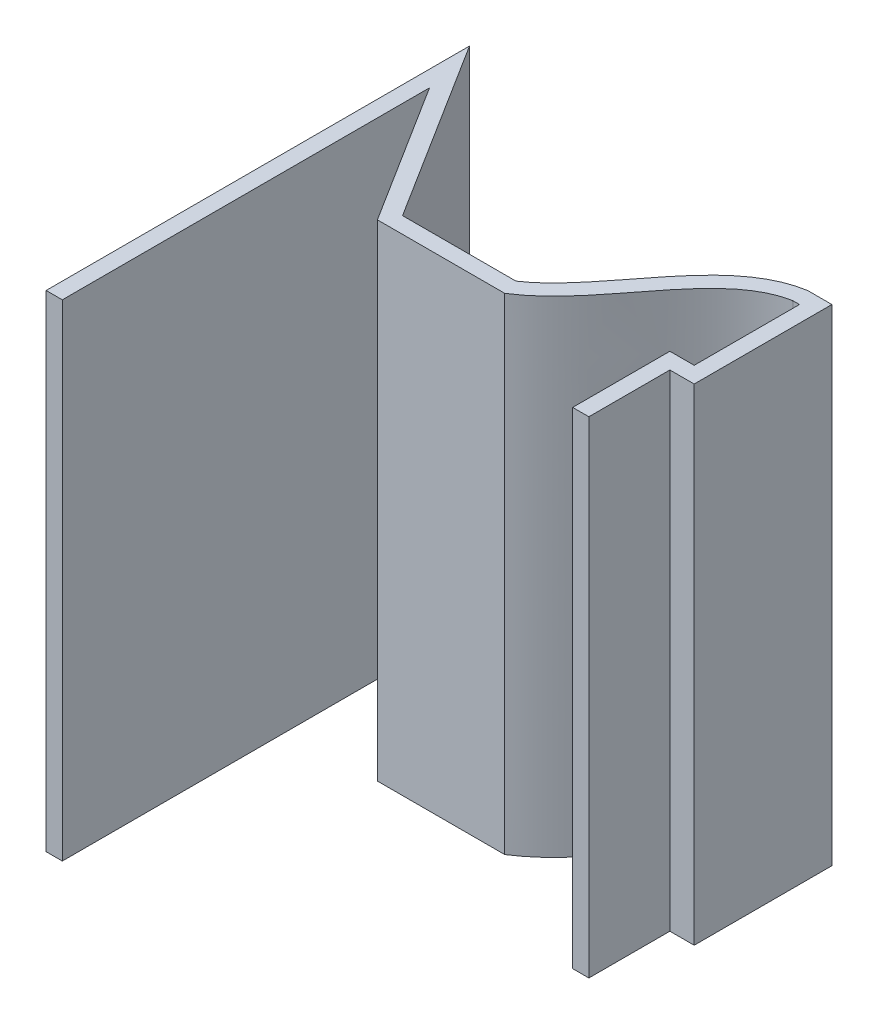
ISO-10303-21;
HEADER;
FILE_DESCRIPTION(('STEP AP214'),'2;1');
FILE_NAME('part.step','',(''),(''),'','','');
FILE_SCHEMA(('AUTOMOTIVE_DESIGN { 1 0 10303 214 1 1 1 1 }'));
ENDSEC;
DATA;
#1=APPLICATION_CONTEXT('core data for automotive mechanical design processes');
#2=APPLICATION_PROTOCOL_DEFINITION('international standard','automotive_design',2000,#1);
#3=PRODUCT_CONTEXT('',#1,'mechanical');
#4=PRODUCT('Part','Part','',(#3));
#5=PRODUCT_RELATED_PRODUCT_CATEGORY('part','',(#4));
#6=PRODUCT_DEFINITION_FORMATION('','',#4);
#7=PRODUCT_DEFINITION_CONTEXT('part definition',#1,'design');
#8=PRODUCT_DEFINITION('design','',#6,#7);
#9=PRODUCT_DEFINITION_SHAPE('','',#8);
#10=(LENGTH_UNIT() NAMED_UNIT(*) SI_UNIT(.MILLI.,.METRE.));
#11=(NAMED_UNIT(*) PLANE_ANGLE_UNIT() SI_UNIT($,.RADIAN.));
#12=(NAMED_UNIT(*) SI_UNIT($,.STERADIAN.) SOLID_ANGLE_UNIT());
#13=UNCERTAINTY_MEASURE_WITH_UNIT(LENGTH_MEASURE(1.E-05),#10,'distance_accuracy_value','');
#14=(GEOMETRIC_REPRESENTATION_CONTEXT(3) GLOBAL_UNCERTAINTY_ASSIGNED_CONTEXT((#13)) GLOBAL_UNIT_ASSIGNED_CONTEXT((#10,
#11,#12)) REPRESENTATION_CONTEXT('',''));
#15=CARTESIAN_POINT('',(0.,0.,0.));
#16=DIRECTION('',(0.,0.,1.));
#17=DIRECTION('',(1.,0.,0.));
#18=AXIS2_PLACEMENT_3D('',#15,#16,#17);
#19=CARTESIAN_POINT('',(-33.,60.,-30.));
#20=DIRECTION('',(0.,0.,1.));
#21=DIRECTION('',(1.,0.,0.));
#22=AXIS2_PLACEMENT_3D('',#19,#20,#21);
#23=PLANE('',#22);
#24=CARTESIAN_POINT('',(-26.,60.,-30.));
#25=DIRECTION('',(0.,0.,1.));
#26=DIRECTION('',(-1.,0.,0.));
#27=AXIS2_PLACEMENT_3D('',#24,#25,#26);
#28=CIRCLE('',#27,58.);
#29=CARTESIAN_POINT('',(-33.,2.42396331806087,-30.));
#30=VERTEX_POINT('',#29);
#31=CARTESIAN_POINT('',(-19.,2.42396331806087,-30.));
#32=VERTEX_POINT('',#31);
#33=EDGE_CURVE('E286',#30,#32,#28,.T.);
#34=ORIENTED_EDGE('',*,*,#33,.F.);
#35=DIRECTION('',(0.,-1.,0.));
#36=VECTOR('',#35,1.);
#37=CARTESIAN_POINT('',(-33.,60.,-30.));
#38=LINE('',#37,#36);
#39=CARTESIAN_POINT('',(-33.,60.,-30.));
#40=VERTEX_POINT('',#39);
#41=EDGE_CURVE('E272',#40,#30,#38,.T.);
#42=ORIENTED_EDGE('',*,*,#41,.F.);
#43=DIRECTION('',(-1.,0.,0.));
#44=VECTOR('',#43,1.);
#45=CARTESIAN_POINT('',(-33.,60.,-30.));
#46=LINE('',#45,#44);
#47=CARTESIAN_POINT('',(-19.,60.,-30.));
#48=VERTEX_POINT('',#47);
#49=EDGE_CURVE('E323',#48,#40,#46,.T.);
#50=ORIENTED_EDGE('',*,*,#49,.F.);
#51=DIRECTION('',(0.,-1.,0.));
#52=VECTOR('',#51,1.);
#53=CARTESIAN_POINT('',(-19.,60.,-30.));
#54=LINE('',#53,#52);
#55=EDGE_CURVE('E275',#48,#32,#54,.T.);
#56=ORIENTED_EDGE('',*,*,#55,.T.);
#57=EDGE_LOOP('',(#34,#42,#50,#56));
#58=FACE_BOUND('',#57,.T.);
#59=ADVANCED_FACE('F34',(#58),#23,.F.);
#60=CARTESIAN_POINT('',(0.,60.,0.));
#61=DIRECTION('',(-1.,0.,0.));
#62=DIRECTION('',(0.,0.,1.));
#63=AXIS2_PLACEMENT_3D('',#60,#61,#62);
#64=PLANE('',#63);
#65=DIRECTION('',(0.,0.,-1.));
#66=VECTOR('',#65,1.);
#67=CARTESIAN_POINT('',(0.,60.,0.));
#68=LINE('',#67,#66);
#69=CARTESIAN_POINT('',(0.,60.,-20.));
#70=VERTEX_POINT('',#69);
#71=CARTESIAN_POINT('',(0.,60.,-30.));
#72=VERTEX_POINT('',#71);
#73=EDGE_CURVE('E187',#70,#72,#68,.T.);
#74=ORIENTED_EDGE('',*,*,#73,.F.);
#75=DIRECTION('',(0.,1.,0.));
#76=VECTOR('',#75,1.);
#77=CARTESIAN_POINT('',(0.,60.,-20.));
#78=LINE('',#77,#76);
#79=CARTESIAN_POINT('',(0.,0.,-20.));
#80=VERTEX_POINT('',#79);
#81=EDGE_CURVE('E176',#80,#70,#78,.T.);
#82=ORIENTED_EDGE('',*,*,#81,.F.);
#83=DIRECTION('',(0.,0.,-1.));
#84=VECTOR('',#83,1.);
#85=CARTESIAN_POINT('',(0.,0.,0.));
#86=LINE('',#85,#84);
#87=CARTESIAN_POINT('',(0.,0.,-30.));
#88=VERTEX_POINT('',#87);
#89=EDGE_CURVE('E185',#80,#88,#86,.T.);
#90=ORIENTED_EDGE('',*,*,#89,.T.);
#91=DIRECTION('',(0.,-1.,0.));
#92=VECTOR('',#91,1.);
#93=CARTESIAN_POINT('',(0.,60.,-30.));
#94=LINE('',#93,#92);
#95=EDGE_CURVE('E42',#72,#88,#94,.T.);
#96=ORIENTED_EDGE('',*,*,#95,.F.);
#97=EDGE_LOOP('',(#74,#82,#90,#96));
#98=FACE_BOUND('',#97,.T.);
#99=ADVANCED_FACE('F36',(#98),#64,.F.);
#100=CARTESIAN_POINT('',(3.00000000000001,60.,-30.));
#101=DIRECTION('',(0.,0.,-1.));
#102=DIRECTION('',(-1.,0.,0.));
#103=AXIS2_PLACEMENT_3D('',#100,#101,#102);
#104=PLANE('',#103);
#105=DIRECTION('',(1.,0.,0.));
#106=VECTOR('',#105,1.);
#107=CARTESIAN_POINT('',(3.00000000000001,0.,-30.));
#108=LINE('',#107,#106);
#109=CARTESIAN_POINT('',(3.00000000000001,0.,-30.));
#110=VERTEX_POINT('',#109);
#111=EDGE_CURVE('E193',#88,#110,#108,.T.);
#112=ORIENTED_EDGE('',*,*,#111,.T.);
#113=DIRECTION('',(0.,-1.,0.));
#114=VECTOR('',#113,1.);
#115=CARTESIAN_POINT('',(3.00000000000001,60.,-30.));
#116=LINE('',#115,#114);
#117=CARTESIAN_POINT('',(3.00000000000001,60.,-30.));
#118=VERTEX_POINT('',#117);
#119=EDGE_CURVE('E491',#118,#110,#116,.T.);
#120=ORIENTED_EDGE('',*,*,#119,.F.);
#121=DIRECTION('',(1.,0.,0.));
#122=VECTOR('',#121,1.);
#123=CARTESIAN_POINT('',(3.00000000000001,60.,-30.));
#124=LINE('',#123,#122);
#125=EDGE_CURVE('E312',#72,#118,#124,.T.);
#126=ORIENTED_EDGE('',*,*,#125,.F.);
#127=ORIENTED_EDGE('',*,*,#95,.T.);
#128=EDGE_LOOP('',(#112,#120,#126,#127));
#129=FACE_BOUND('',#128,.T.);
#130=ADVANCED_FACE('F341',(#129),#104,.F.);
#131=CARTESIAN_POINT('',(3.00000000000001,60.,-47.));
#132=DIRECTION('',(-1.,0.,0.));
#133=DIRECTION('',(0.,0.,1.));
#134=AXIS2_PLACEMENT_3D('',#131,#132,#133);
#135=PLANE('',#134);
#136=DIRECTION('',(0.,0.,-1.));
#137=VECTOR('',#136,1.);
#138=CARTESIAN_POINT('',(3.00000000000001,0.,-47.));
#139=LINE('',#138,#137);
#140=CARTESIAN_POINT('',(3.00000000000001,0.,-47.));
#141=VERTEX_POINT('',#140);
#142=EDGE_CURVE('E196',#110,#141,#139,.T.);
#143=ORIENTED_EDGE('',*,*,#142,.T.);
#144=DIRECTION('',(0.,-1.,0.));
#145=VECTOR('',#144,1.);
#146=CARTESIAN_POINT('',(3.00000000000001,60.,-47.));
#147=LINE('',#146,#145);
#148=CARTESIAN_POINT('',(3.00000000000001,60.,-47.));
#149=VERTEX_POINT('',#148);
#150=EDGE_CURVE('E489',#149,#141,#147,.T.);
#151=ORIENTED_EDGE('',*,*,#150,.F.);
#152=DIRECTION('',(0.,0.,-1.));
#153=VECTOR('',#152,1.);
#154=CARTESIAN_POINT('',(3.00000000000001,60.,-47.));
#155=LINE('',#154,#153);
#156=EDGE_CURVE('E314',#118,#149,#155,.T.);
#157=ORIENTED_EDGE('',*,*,#156,.F.);
#158=ORIENTED_EDGE('',*,*,#119,.T.);
#159=EDGE_LOOP('',(#143,#151,#157,#158));
#160=FACE_BOUND('',#159,.T.);
#161=ADVANCED_FACE('F338',(#160),#135,.F.);
#162=CARTESIAN_POINT('',(0.,60.,-47.));
#163=DIRECTION('',(0.,0.,1.));
#164=DIRECTION('',(1.,0.,0.));
#165=AXIS2_PLACEMENT_3D('',#162,#163,#164);
#166=PLANE('',#165);
#167=DIRECTION('',(-1.,0.,0.));
#168=VECTOR('',#167,1.);
#169=CARTESIAN_POINT('',(0.,0.,-47.));
#170=LINE('',#169,#168);
#171=CARTESIAN_POINT('',(0.,0.,-47.));
#172=VERTEX_POINT('',#171);
#173=EDGE_CURVE('E206',#141,#172,#170,.T.);
#174=ORIENTED_EDGE('',*,*,#173,.T.);
#175=DIRECTION('',(0.,-1.,0.));
#176=VECTOR('',#175,1.);
#177=CARTESIAN_POINT('',(0.,60.,-47.));
#178=LINE('',#177,#176);
#179=CARTESIAN_POINT('',(0.,60.,-47.));
#180=VERTEX_POINT('',#179);
#181=EDGE_CURVE('E278',#180,#172,#178,.T.);
#182=ORIENTED_EDGE('',*,*,#181,.F.);
#183=DIRECTION('',(-1.,0.,0.));
#184=VECTOR('',#183,1.);
#185=CARTESIAN_POINT('',(0.,60.,-47.));
#186=LINE('',#185,#184);
#187=EDGE_CURVE('E316',#149,#180,#186,.T.);
#188=ORIENTED_EDGE('',*,*,#187,.F.);
#189=ORIENTED_EDGE('',*,*,#150,.T.);
#190=EDGE_LOOP('',(#174,#182,#188,#189));
#191=FACE_BOUND('',#190,.T.);
#192=ADVANCED_FACE('F334',(#191),#166,.F.);
#193=CARTESIAN_POINT('',(0.,60.,-47.));
#194=CARTESIAN_POINT('',(-8.73584233414626,60.,-45.5222627040715));
#195=CARTESIAN_POINT('',(-12.4111987064461,60.,-34.4626890083698));
#196=CARTESIAN_POINT('',(-19.,60.,-30.));
#197=B_SPLINE_CURVE_WITH_KNOTS('',3,(#193,#194,#195,#196),.UNSPECIFIED.,.F.,.F.,(4,4),(0.,1.),.UNSPECIFIED.);
#198=DIRECTION('',(0.,-1.,0.));
#199=VECTOR('',#198,1.);
#200=SURFACE_OF_LINEAR_EXTRUSION('',#197,#199);
#201=CARTESIAN_POINT('',(0.,0.,-47.));
#202=CARTESIAN_POINT('',(-8.73584233414626,0.,-45.5222627040715));
#203=CARTESIAN_POINT('',(-12.4111987064461,0.,-34.4626890083698));
#204=CARTESIAN_POINT('',(-19.,0.,-30.));
#205=B_SPLINE_CURVE_WITH_KNOTS('',3,(#201,#202,#203,#204),.UNSPECIFIED.,.F.,.F.,(4,4),(0.,1.),.UNSPECIFIED.);
#206=CARTESIAN_POINT('',(-19.,0.,-30.));
#207=VERTEX_POINT('',#206);
#208=EDGE_CURVE('E208',#172,#207,#205,.T.);
#209=ORIENTED_EDGE('',*,*,#208,.T.);
#210=DIRECTION('',(0.,-1.,0.));
#211=VECTOR('',#210,1.);
#212=CARTESIAN_POINT('',(-19.,0.,-30.));
#213=LINE('',#212,#211);
#214=EDGE_CURVE('E56',#32,#207,#213,.T.);
#215=ORIENTED_EDGE('',*,*,#214,.F.);
#216=ORIENTED_EDGE('',*,*,#55,.F.);
#217=EDGE_CURVE('E318',#180,#48,#197,.T.);
#218=ORIENTED_EDGE('',*,*,#217,.F.);
#219=ORIENTED_EDGE('',*,*,#181,.T.);
#220=EDGE_LOOP('',(#209,#215,#216,#218,#219));
#221=FACE_BOUND('',#220,.T.);
#222=ADVANCED_FACE('F329',(#221),#200,.F.);
#223=CARTESIAN_POINT('',(-47.0000000000014,60.,-52.2683878090264));
#224=DIRECTION('',(-0.846589823711185,0.,0.532245873998723));
#225=DIRECTION('',(0.532245873998723,0.,0.846589823711185));
#226=AXIS2_PLACEMENT_3D('',#223,#224,#225);
#227=PLANE('',#226);
#228=DIRECTION('',(-0.532245873998723,0.,-0.846589823711185));
#229=VECTOR('',#228,1.);
#230=CARTESIAN_POINT('',(-47.0000000000014,0.,-52.2683878090264));
#231=LINE('',#230,#229);
#232=CARTESIAN_POINT('',(-33.,0.,-30.));
#233=VERTEX_POINT('',#232);
#234=CARTESIAN_POINT('',(-47.0000000000014,0.,-52.2683878090264));
#235=VERTEX_POINT('',#234);
#236=EDGE_CURVE('E212',#233,#235,#231,.T.);
#237=ORIENTED_EDGE('',*,*,#236,.T.);
#238=DIRECTION('',(0.,-1.,0.));
#239=VECTOR('',#238,1.);
#240=CARTESIAN_POINT('',(-47.0000000000014,60.,-52.2683878090264));
#241=LINE('',#240,#239);
#242=CARTESIAN_POINT('',(-47.0000000000014,60.,-52.2683878090264));
#243=VERTEX_POINT('',#242);
#244=EDGE_CURVE('E269',#243,#235,#241,.T.);
#245=ORIENTED_EDGE('',*,*,#244,.F.);
#246=DIRECTION('',(-0.532245873998723,0.,-0.846589823711185));
#247=VECTOR('',#246,1.);
#248=CARTESIAN_POINT('',(-47.0000000000014,60.,-52.2683878090264));
#249=LINE('',#248,#247);
#250=EDGE_CURVE('E362',#40,#243,#249,.T.);
#251=ORIENTED_EDGE('',*,*,#250,.F.);
#252=ORIENTED_EDGE('',*,*,#41,.T.);
#253=DIRECTION('',(0.,1.,0.));
#254=VECTOR('',#253,1.);
#255=CARTESIAN_POINT('',(-33.,0.,-30.));
#256=LINE('',#255,#254);
#257=EDGE_CURVE('E291',#233,#30,#256,.T.);
#258=ORIENTED_EDGE('',*,*,#257,.F.);
#259=EDGE_LOOP('',(#237,#245,#251,#252,#258));
#260=FACE_BOUND('',#259,.T.);
#261=ADVANCED_FACE('F333',(#260),#227,.F.);
#262=CARTESIAN_POINT('',(-47.0000000000014,60.,0.));
#263=DIRECTION('',(1.,0.,0.));
#264=DIRECTION('',(0.,0.,-1.));
#265=AXIS2_PLACEMENT_3D('',#262,#263,#264);
#266=PLANE('',#265);
#267=DIRECTION('',(0.,0.,1.));
#268=VECTOR('',#267,1.);
#269=CARTESIAN_POINT('',(-47.0000000000014,0.,0.));
#270=LINE('',#269,#268);
#271=CARTESIAN_POINT('',(-47.0000000000014,0.,0.));
#272=VERTEX_POINT('',#271);
#273=EDGE_CURVE('E217',#235,#272,#270,.T.);
#274=ORIENTED_EDGE('',*,*,#273,.T.);
#275=DIRECTION('',(0.,-1.,0.));
#276=VECTOR('',#275,1.);
#277=CARTESIAN_POINT('',(-47.0000000000014,60.,0.));
#278=LINE('',#277,#276);
#279=CARTESIAN_POINT('',(-47.0000000000014,60.,0.));
#280=VERTEX_POINT('',#279);
#281=EDGE_CURVE('E266',#280,#272,#278,.T.);
#282=ORIENTED_EDGE('',*,*,#281,.F.);
#283=DIRECTION('',(0.,0.,1.));
#284=VECTOR('',#283,1.);
#285=CARTESIAN_POINT('',(-47.0000000000014,60.,0.));
#286=LINE('',#285,#284);
#287=EDGE_CURVE('E437',#243,#280,#286,.T.);
#288=ORIENTED_EDGE('',*,*,#287,.F.);
#289=ORIENTED_EDGE('',*,*,#244,.T.);
#290=EDGE_LOOP('',(#274,#282,#288,#289));
#291=FACE_BOUND('',#290,.T.);
#292=ADVANCED_FACE('F436',(#291),#266,.F.);
#293=CARTESIAN_POINT('',(-47.0000000000014,60.,0.));
#294=DIRECTION('',(0.,0.,-1.));
#295=DIRECTION('',(-1.,0.,0.));
#296=AXIS2_PLACEMENT_3D('',#293,#294,#295);
#297=PLANE('',#296);
#298=DIRECTION('',(1.,0.,0.));
#299=VECTOR('',#298,1.);
#300=CARTESIAN_POINT('',(-47.0000000000014,0.,0.));
#301=LINE('',#300,#299);
#302=CARTESIAN_POINT('',(-45.0000000000014,0.,0.));
#303=VERTEX_POINT('',#302);
#304=EDGE_CURVE('E219',#272,#303,#301,.T.);
#305=ORIENTED_EDGE('',*,*,#304,.T.);
#306=DIRECTION('',(0.,-1.,0.));
#307=VECTOR('',#306,1.);
#308=CARTESIAN_POINT('',(-45.0000000000014,60.,0.));
#309=LINE('',#308,#307);
#310=CARTESIAN_POINT('',(-45.0000000000014,60.,0.));
#311=VERTEX_POINT('',#310);
#312=EDGE_CURVE('E263',#311,#303,#309,.T.);
#313=ORIENTED_EDGE('',*,*,#312,.F.);
#314=DIRECTION('',(1.,0.,0.));
#315=VECTOR('',#314,1.);
#316=CARTESIAN_POINT('',(-47.0000000000014,60.,0.));
#317=LINE('',#316,#315);
#318=EDGE_CURVE('E432',#280,#311,#317,.T.);
#319=ORIENTED_EDGE('',*,*,#318,.F.);
#320=ORIENTED_EDGE('',*,*,#281,.T.);
#321=EDGE_LOOP('',(#305,#313,#319,#320));
#322=FACE_BOUND('',#321,.T.);
#323=ADVANCED_FACE('F431',(#322),#297,.F.);
#324=CARTESIAN_POINT('',(-45.0000000000014,60.,0.));
#325=DIRECTION('',(-1.,0.,0.));
#326=DIRECTION('',(0.,0.,1.));
#327=AXIS2_PLACEMENT_3D('',#324,#325,#326);
#328=PLANE('',#327);
#329=DIRECTION('',(0.,0.,-1.));
#330=VECTOR('',#329,1.);
#331=CARTESIAN_POINT('',(-45.0000000000014,0.,0.));
#332=LINE('',#331,#330);
#333=CARTESIAN_POINT('',(-45.0000000000014,0.,-45.3295277298006));
#334=VERTEX_POINT('',#333);
#335=EDGE_CURVE('E221',#303,#334,#332,.T.);
#336=ORIENTED_EDGE('',*,*,#335,.T.);
#337=DIRECTION('',(0.,-1.,0.));
#338=VECTOR('',#337,1.);
#339=CARTESIAN_POINT('',(-45.0000000000014,60.,-45.3295277298006));
#340=LINE('',#339,#338);
#341=CARTESIAN_POINT('',(-45.0000000000014,60.,-45.3295277298006));
#342=VERTEX_POINT('',#341);
#343=EDGE_CURVE('E260',#342,#334,#340,.T.);
#344=ORIENTED_EDGE('',*,*,#343,.F.);
#345=DIRECTION('',(0.,0.,-1.));
#346=VECTOR('',#345,1.);
#347=CARTESIAN_POINT('',(-45.0000000000014,60.,0.));
#348=LINE('',#347,#346);
#349=EDGE_CURVE('E428',#311,#342,#348,.T.);
#350=ORIENTED_EDGE('',*,*,#349,.F.);
#351=ORIENTED_EDGE('',*,*,#312,.T.);
#352=EDGE_LOOP('',(#336,#344,#350,#351));
#353=FACE_BOUND('',#352,.T.);
#354=ADVANCED_FACE('F425',(#353),#328,.F.);
#355=CARTESIAN_POINT('',(-45.0000000000014,60.,-45.3295277298006));
#356=DIRECTION('',(0.846589823711185,0.,-0.532245873998723));
#357=DIRECTION('',(-0.532245873998723,0.,-0.846589823711185));
#358=AXIS2_PLACEMENT_3D('',#355,#356,#357);
#359=PLANE('',#358);
#360=DIRECTION('',(0.532245873998723,0.,0.846589823711185));
#361=VECTOR('',#360,1.);
#362=CARTESIAN_POINT('',(-45.0000000000014,0.,-45.3295277298006));
#363=LINE('',#362,#361);
#364=CARTESIAN_POINT('',(-34.1050312982757,0.,-28.));
#365=VERTEX_POINT('',#364);
#366=EDGE_CURVE('E223',#334,#365,#363,.T.);
#367=ORIENTED_EDGE('',*,*,#366,.T.);
#368=DIRECTION('',(0.,-1.,0.));
#369=VECTOR('',#368,1.);
#370=CARTESIAN_POINT('',(-34.1050312982757,60.,-28.));
#371=LINE('',#370,#369);
#372=CARTESIAN_POINT('',(-34.1050312982757,60.,-28.));
#373=VERTEX_POINT('',#372);
#374=EDGE_CURVE('E257',#373,#365,#371,.T.);
#375=ORIENTED_EDGE('',*,*,#374,.F.);
#376=DIRECTION('',(0.532245873998723,0.,0.846589823711185));
#377=VECTOR('',#376,1.);
#378=CARTESIAN_POINT('',(-45.0000000000014,60.,-45.3295277298006));
#379=LINE('',#378,#377);
#380=EDGE_CURVE('E419',#342,#373,#379,.T.);
#381=ORIENTED_EDGE('',*,*,#380,.F.);
#382=ORIENTED_EDGE('',*,*,#343,.T.);
#383=EDGE_LOOP('',(#367,#375,#381,#382));
#384=FACE_BOUND('',#383,.T.);
#385=ADVANCED_FACE('F418',(#384),#359,.F.);
#386=CARTESIAN_POINT('',(-34.1050312982757,60.,-28.));
#387=DIRECTION('',(0.,0.,-1.));
#388=DIRECTION('',(-1.,0.,0.));
#389=AXIS2_PLACEMENT_3D('',#386,#387,#388);
#390=PLANE('',#389);
#391=DIRECTION('',(1.,0.,0.));
#392=VECTOR('',#391,1.);
#393=CARTESIAN_POINT('',(-34.1050312982757,0.,-28.));
#394=LINE('',#393,#392);
#395=CARTESIAN_POINT('',(-18.3864321192035,0.,-28.));
#396=VERTEX_POINT('',#395);
#397=EDGE_CURVE('E225',#365,#396,#394,.T.);
#398=ORIENTED_EDGE('',*,*,#397,.T.);
#399=DIRECTION('',(0.,-1.,0.));
#400=VECTOR('',#399,1.);
#401=CARTESIAN_POINT('',(-18.3864321192035,60.,-28.));
#402=LINE('',#401,#400);
#403=CARTESIAN_POINT('',(-18.3864321192035,60.,-28.));
#404=VERTEX_POINT('',#403);
#405=EDGE_CURVE('E254',#404,#396,#402,.T.);
#406=ORIENTED_EDGE('',*,*,#405,.F.);
#407=DIRECTION('',(1.,0.,0.));
#408=VECTOR('',#407,1.);
#409=CARTESIAN_POINT('',(-34.1050312982757,60.,-28.));
#410=LINE('',#409,#408);
#411=EDGE_CURVE('E414',#373,#404,#410,.T.);
#412=ORIENTED_EDGE('',*,*,#411,.F.);
#413=ORIENTED_EDGE('',*,*,#374,.T.);
#414=EDGE_LOOP('',(#398,#406,#412,#413));
#415=FACE_BOUND('',#414,.T.);
#416=ADVANCED_FACE('F413',(#415),#390,.F.);
#417=CARTESIAN_POINT('',(-18.3864321192035,60.,-28.));
#418=CARTESIAN_POINT('',(-18.2815893742478,60.,-28.0710114851967));
#419=CARTESIAN_POINT('',(-18.0760068723759,60.,-28.2106437719707));
#420=CARTESIAN_POINT('',(-17.6320179643157,60.,-28.509033814474));
#421=CARTESIAN_POINT('',(-16.7887521593678,60.,-29.1277652283063));
#422=CARTESIAN_POINT('',(-15.2661015968213,60.,-30.4367065139176));
#423=CARTESIAN_POINT('',(-13.2817697640349,60.,-32.5788076211878));
#424=CARTESIAN_POINT('',(-11.1163234460396,60.,-35.322397152847));
#425=CARTESIAN_POINT('',(-8.32798345233119,60.,-38.971629636865));
#426=CARTESIAN_POINT('',(-4.79633227596985,60.,-42.9892919880486));
#427=CARTESIAN_POINT('',(-1.60539687193576,60.,-44.6674290510028));
#428=CARTESIAN_POINT('',(0.176102142023165,60.,-45.));
#429=B_SPLINE_CURVE_WITH_KNOTS('',3,(#417,#418,#419,#420,#421,#422,#423,#424,#425,#426,#427,
#428),.UNSPECIFIED.,.F.,.F.,(4,1,1,1,1,1,1,1,1,4),(0.00731574432767523,0.0232280082258565,
0.0391402721240377,0.0709647999204002,0.134613855513125,0.261911966698575,0.389210077884025,
0.516508189069474,0.771104411440374,1.02570063381127),.UNSPECIFIED.);
#430=DIRECTION('',(0.,-1.,0.));
#431=VECTOR('',#430,1.);
#432=SURFACE_OF_LINEAR_EXTRUSION('',#429,#431);
#433=CARTESIAN_POINT('',(-18.3864321192035,0.,-28.));
#434=CARTESIAN_POINT('',(-18.2815893742478,0.,-28.0710114851967));
#435=CARTESIAN_POINT('',(-18.0760068723759,0.,-28.2106437719707));
#436=CARTESIAN_POINT('',(-17.6320179643157,0.,-28.509033814474));
#437=CARTESIAN_POINT('',(-16.7887521593678,0.,-29.1277652283063));
#438=CARTESIAN_POINT('',(-15.2661015968213,0.,-30.4367065139176));
#439=CARTESIAN_POINT('',(-13.2817697640349,0.,-32.5788076211878));
#440=CARTESIAN_POINT('',(-11.1163234460396,0.,-35.322397152847));
#441=CARTESIAN_POINT('',(-8.32798345233119,0.,-38.971629636865));
#442=CARTESIAN_POINT('',(-4.79633227596985,0.,-42.9892919880486));
#443=CARTESIAN_POINT('',(-1.60539687193576,0.,-44.6674290510028));
#444=CARTESIAN_POINT('',(0.176102142023165,0.,-45.));
#445=B_SPLINE_CURVE_WITH_KNOTS('',3,(#433,#434,#435,#436,#437,#438,#439,#440,#441,#442,#443,
#444),.UNSPECIFIED.,.F.,.F.,(4,1,1,1,1,1,1,1,1,4),(0.00731574432767523,0.0232280082258565,
0.0391402721240377,0.0709647999204002,0.134613855513125,0.261911966698575,0.389210077884025,
0.516508189069474,0.771104411440374,1.02570063381127),.UNSPECIFIED.);
#446=CARTESIAN_POINT('',(0.176102142023165,0.,-45.));
#447=VERTEX_POINT('',#446);
#448=EDGE_CURVE('E227',#396,#447,#445,.T.);
#449=ORIENTED_EDGE('',*,*,#448,.T.);
#450=DIRECTION('',(0.,-1.,0.));
#451=VECTOR('',#450,1.);
#452=CARTESIAN_POINT('',(0.176102142023165,60.,-45.));
#453=LINE('',#452,#451);
#454=CARTESIAN_POINT('',(0.176102142023165,60.,-45.));
#455=VERTEX_POINT('',#454);
#456=EDGE_CURVE('E251',#455,#447,#453,.T.);
#457=ORIENTED_EDGE('',*,*,#456,.F.);
#458=EDGE_CURVE('E410',#404,#455,#429,.T.);
#459=ORIENTED_EDGE('',*,*,#458,.F.);
#460=ORIENTED_EDGE('',*,*,#405,.T.);
#461=EDGE_LOOP('',(#449,#457,#459,#460));
#462=FACE_BOUND('',#461,.T.);
#463=ADVANCED_FACE('F407',(#462),#432,.F.);
#464=CARTESIAN_POINT('',(0.176102142023165,60.,-45.));
#465=DIRECTION('',(0.,0.,-1.));
#466=DIRECTION('',(-1.,0.,0.));
#467=AXIS2_PLACEMENT_3D('',#464,#465,#466);
#468=PLANE('',#467);
#469=DIRECTION('',(1.,0.,0.));
#470=VECTOR('',#469,1.);
#471=CARTESIAN_POINT('',(0.176102142023165,0.,-45.));
#472=LINE('',#471,#470);
#473=CARTESIAN_POINT('',(1.00000000000001,0.,-45.));
#474=VERTEX_POINT('',#473);
#475=EDGE_CURVE('E231',#447,#474,#472,.T.);
#476=ORIENTED_EDGE('',*,*,#475,.T.);
#477=DIRECTION('',(0.,-1.,0.));
#478=VECTOR('',#477,1.);
#479=CARTESIAN_POINT('',(1.00000000000001,60.,-45.));
#480=LINE('',#479,#478);
#481=CARTESIAN_POINT('',(1.00000000000001,60.,-45.));
#482=VERTEX_POINT('',#481);
#483=EDGE_CURVE('E248',#482,#474,#480,.T.);
#484=ORIENTED_EDGE('',*,*,#483,.F.);
#485=DIRECTION('',(1.,0.,0.));
#486=VECTOR('',#485,1.);
#487=CARTESIAN_POINT('',(0.176102142023165,60.,-45.));
#488=LINE('',#487,#486);
#489=EDGE_CURVE('E401',#455,#482,#488,.T.);
#490=ORIENTED_EDGE('',*,*,#489,.F.);
#491=ORIENTED_EDGE('',*,*,#456,.T.);
#492=EDGE_LOOP('',(#476,#484,#490,#491));
#493=FACE_BOUND('',#492,.T.);
#494=ADVANCED_FACE('F400',(#493),#468,.F.);
#495=CARTESIAN_POINT('',(1.00000000000001,60.,-45.));
#496=DIRECTION('',(1.,0.,0.));
#497=DIRECTION('',(0.,0.,-1.));
#498=AXIS2_PLACEMENT_3D('',#495,#496,#497);
#499=PLANE('',#498);
#500=DIRECTION('',(0.,0.,1.));
#501=VECTOR('',#500,1.);
#502=CARTESIAN_POINT('',(1.00000000000001,0.,-45.));
#503=LINE('',#502,#501);
#504=CARTESIAN_POINT('',(1.00000000000001,0.,-32.));
#505=VERTEX_POINT('',#504);
#506=EDGE_CURVE('E236',#474,#505,#503,.T.);
#507=ORIENTED_EDGE('',*,*,#506,.T.);
#508=DIRECTION('',(0.,-1.,0.));
#509=VECTOR('',#508,1.);
#510=CARTESIAN_POINT('',(1.00000000000001,60.,-32.));
#511=LINE('',#510,#509);
#512=CARTESIAN_POINT('',(1.00000000000001,60.,-32.));
#513=VERTEX_POINT('',#512);
#514=EDGE_CURVE('E245',#513,#505,#511,.T.);
#515=ORIENTED_EDGE('',*,*,#514,.F.);
#516=DIRECTION('',(0.,0.,1.));
#517=VECTOR('',#516,1.);
#518=CARTESIAN_POINT('',(1.00000000000001,60.,-45.));
#519=LINE('',#518,#517);
#520=EDGE_CURVE('E396',#482,#513,#519,.T.);
#521=ORIENTED_EDGE('',*,*,#520,.F.);
#522=ORIENTED_EDGE('',*,*,#483,.T.);
#523=EDGE_LOOP('',(#507,#515,#521,#522));
#524=FACE_BOUND('',#523,.T.);
#525=ADVANCED_FACE('F395',(#524),#499,.F.);
#526=CARTESIAN_POINT('',(1.00000000000001,60.,-32.));
#527=DIRECTION('',(0.,0.,1.));
#528=DIRECTION('',(1.,0.,0.));
#529=AXIS2_PLACEMENT_3D('',#526,#527,#528);
#530=PLANE('',#529);
#531=DIRECTION('',(-1.,0.,0.));
#532=VECTOR('',#531,1.);
#533=CARTESIAN_POINT('',(1.00000000000001,0.,-32.));
#534=LINE('',#533,#532);
#535=CARTESIAN_POINT('',(-2.,0.,-32.));
#536=VERTEX_POINT('',#535);
#537=EDGE_CURVE('E238',#505,#536,#534,.T.);
#538=ORIENTED_EDGE('',*,*,#537,.T.);
#539=DIRECTION('',(0.,-1.,0.));
#540=VECTOR('',#539,1.);
#541=CARTESIAN_POINT('',(-2.,60.,-32.));
#542=LINE('',#541,#540);
#543=CARTESIAN_POINT('',(-2.,60.,-32.));
#544=VERTEX_POINT('',#543);
#545=EDGE_CURVE('E242',#544,#536,#542,.T.);
#546=ORIENTED_EDGE('',*,*,#545,.F.);
#547=DIRECTION('',(-1.,0.,0.));
#548=VECTOR('',#547,1.);
#549=CARTESIAN_POINT('',(1.00000000000001,60.,-32.));
#550=LINE('',#549,#548);
#551=EDGE_CURVE('E392',#513,#544,#550,.T.);
#552=ORIENTED_EDGE('',*,*,#551,.F.);
#553=ORIENTED_EDGE('',*,*,#514,.T.);
#554=EDGE_LOOP('',(#538,#546,#552,#553));
#555=FACE_BOUND('',#554,.T.);
#556=ADVANCED_FACE('F389',(#555),#530,.F.);
#557=CARTESIAN_POINT('',(-2.,60.,0.));
#558=DIRECTION('',(1.,0.,0.));
#559=DIRECTION('',(0.,0.,-1.));
#560=AXIS2_PLACEMENT_3D('',#557,#558,#559);
#561=PLANE('',#560);
#562=DIRECTION('',(0.,0.,1.));
#563=VECTOR('',#562,1.);
#564=CARTESIAN_POINT('',(-2.,0.,0.));
#565=LINE('',#564,#563);
#566=CARTESIAN_POINT('',(-2.,0.,-20.));
#567=VERTEX_POINT('',#566);
#568=EDGE_CURVE('E240',#536,#567,#565,.T.);
#569=ORIENTED_EDGE('',*,*,#568,.T.);
#570=DIRECTION('',(0.,1.,0.));
#571=VECTOR('',#570,1.);
#572=CARTESIAN_POINT('',(-2.,60.,-20.));
#573=LINE('',#572,#571);
#574=CARTESIAN_POINT('',(-2.,60.,-20.));
#575=VERTEX_POINT('',#574);
#576=EDGE_CURVE('E48',#567,#575,#573,.T.);
#577=ORIENTED_EDGE('',*,*,#576,.T.);
#578=DIRECTION('',(0.,0.,1.));
#579=VECTOR('',#578,1.);
#580=CARTESIAN_POINT('',(-2.,60.,0.));
#581=LINE('',#580,#579);
#582=EDGE_CURVE('E202',#544,#575,#581,.T.);
#583=ORIENTED_EDGE('',*,*,#582,.F.);
#584=ORIENTED_EDGE('',*,*,#545,.T.);
#585=EDGE_LOOP('',(#569,#577,#583,#584));
#586=FACE_BOUND('',#585,.T.);
#587=ADVANCED_FACE('F383',(#586),#561,.F.);
#588=CARTESIAN_POINT('',(-10.3051403902222,60.,-39.6193568921655));
#589=DIRECTION('',(0.,-1.,0.));
#590=DIRECTION('',(0.,0.,-1.));
#591=AXIS2_PLACEMENT_3D('',#588,#589,#590);
#592=PLANE('',#591);
#593=ORIENTED_EDGE('',*,*,#582,.T.);
#594=DIRECTION('',(1.,0.,0.));
#595=VECTOR('',#594,1.);
#596=CARTESIAN_POINT('',(-10.,60.,-20.));
#597=LINE('',#596,#595);
#598=EDGE_CURVE('E188',#575,#70,#597,.T.);
#599=ORIENTED_EDGE('',*,*,#598,.T.);
#600=ORIENTED_EDGE('',*,*,#73,.T.);
#601=ORIENTED_EDGE('',*,*,#125,.T.);
#602=ORIENTED_EDGE('',*,*,#156,.T.);
#603=ORIENTED_EDGE('',*,*,#187,.T.);
#604=ORIENTED_EDGE('',*,*,#217,.T.);
#605=ORIENTED_EDGE('',*,*,#49,.T.);
#606=ORIENTED_EDGE('',*,*,#250,.T.);
#607=ORIENTED_EDGE('',*,*,#287,.T.);
#608=ORIENTED_EDGE('',*,*,#318,.T.);
#609=ORIENTED_EDGE('',*,*,#349,.T.);
#610=ORIENTED_EDGE('',*,*,#380,.T.);
#611=ORIENTED_EDGE('',*,*,#411,.T.);
#612=ORIENTED_EDGE('',*,*,#458,.T.);
#613=ORIENTED_EDGE('',*,*,#489,.T.);
#614=ORIENTED_EDGE('',*,*,#520,.T.);
#615=ORIENTED_EDGE('',*,*,#551,.T.);
#616=EDGE_LOOP('',(#593,#599,#600,#601,#602,#603,#604,#605,#606,#607,#608,#609,#610,#611,#612,
#613,#614,#615));
#617=FACE_BOUND('',#616,.T.);
#618=ADVANCED_FACE('F380',(#617),#592,.F.);
#619=CARTESIAN_POINT('',(-10.3051403902222,0.,-39.6193568921655));
#620=DIRECTION('',(0.,-1.,0.));
#621=DIRECTION('',(0.,0.,-1.));
#622=AXIS2_PLACEMENT_3D('',#619,#620,#621);
#623=PLANE('',#622);
#624=DIRECTION('',(1.,0.,0.));
#625=VECTOR('',#624,1.);
#626=CARTESIAN_POINT('',(-10.3051403902222,0.,-20.));
#627=LINE('',#626,#625);
#628=EDGE_CURVE('E11',#567,#80,#627,.T.);
#629=ORIENTED_EDGE('',*,*,#628,.F.);
#630=ORIENTED_EDGE('',*,*,#568,.F.);
#631=ORIENTED_EDGE('',*,*,#537,.F.);
#632=ORIENTED_EDGE('',*,*,#506,.F.);
#633=ORIENTED_EDGE('',*,*,#475,.F.);
#634=ORIENTED_EDGE('',*,*,#448,.F.);
#635=ORIENTED_EDGE('',*,*,#397,.F.);
#636=ORIENTED_EDGE('',*,*,#366,.F.);
#637=ORIENTED_EDGE('',*,*,#335,.F.);
#638=ORIENTED_EDGE('',*,*,#304,.F.);
#639=ORIENTED_EDGE('',*,*,#273,.F.);
#640=ORIENTED_EDGE('',*,*,#236,.F.);
#641=DIRECTION('',(0.,0.,1.));
#642=VECTOR('',#641,1.);
#643=CARTESIAN_POINT('',(-33.,0.,-38.));
#644=LINE('',#643,#642);
#645=CARTESIAN_POINT('',(-33.,0.,-38.));
#646=VERTEX_POINT('',#645);
#647=EDGE_CURVE('E301',#646,#233,#644,.T.);
#648=ORIENTED_EDGE('',*,*,#647,.F.);
#649=DIRECTION('',(-1.,0.,0.));
#650=VECTOR('',#649,1.);
#651=CARTESIAN_POINT('',(-33.,0.,-38.));
#652=LINE('',#651,#650);
#653=CARTESIAN_POINT('',(-19.,0.,-38.));
#654=VERTEX_POINT('',#653);
#655=EDGE_CURVE('E307',#654,#646,#652,.T.);
#656=ORIENTED_EDGE('',*,*,#655,.F.);
#657=DIRECTION('',(0.,0.,1.));
#658=VECTOR('',#657,1.);
#659=CARTESIAN_POINT('',(-19.,0.,-38.));
#660=LINE('',#659,#658);
#661=EDGE_CURVE('E295',#654,#207,#660,.T.);
#662=ORIENTED_EDGE('',*,*,#661,.T.);
#663=ORIENTED_EDGE('',*,*,#208,.F.);
#664=ORIENTED_EDGE('',*,*,#173,.F.);
#665=ORIENTED_EDGE('',*,*,#142,.F.);
#666=ORIENTED_EDGE('',*,*,#111,.F.);
#667=ORIENTED_EDGE('',*,*,#89,.F.);
#668=EDGE_LOOP('',(#629,#630,#631,#632,#633,#634,#635,#636,#637,#638,#639,#640,#648,#656,#662,
#663,#664,#665,#666,#667));
#669=FACE_BOUND('',#668,.T.);
#670=ADVANCED_FACE('F191',(#669),#623,.T.);
#671=CARTESIAN_POINT('',(-33.,0.,-38.));
#672=DIRECTION('',(1.,0.,0.));
#673=DIRECTION('',(0.,0.,-1.));
#674=AXIS2_PLACEMENT_3D('',#671,#672,#673);
#675=PLANE('',#674);
#676=ORIENTED_EDGE('',*,*,#257,.T.);
#677=DIRECTION('',(0.,0.,1.));
#678=VECTOR('',#677,1.);
#679=CARTESIAN_POINT('',(-33.,2.42396331806087,-38.));
#680=LINE('',#679,#678);
#681=CARTESIAN_POINT('',(-33.,2.42396331806087,-38.));
#682=VERTEX_POINT('',#681);
#683=EDGE_CURVE('E194',#682,#30,#680,.T.);
#684=ORIENTED_EDGE('',*,*,#683,.F.);
#685=DIRECTION('',(0.,1.,0.));
#686=VECTOR('',#685,1.);
#687=CARTESIAN_POINT('',(-33.,0.,-38.));
#688=LINE('',#687,#686);
#689=EDGE_CURVE('E285',#646,#682,#688,.T.);
#690=ORIENTED_EDGE('',*,*,#689,.F.);
#691=ORIENTED_EDGE('',*,*,#647,.T.);
#692=EDGE_LOOP('',(#676,#684,#690,#691));
#693=FACE_BOUND('',#692,.T.);
#694=ADVANCED_FACE('F369',(#693),#675,.F.);
#695=CARTESIAN_POINT('',(-26.,60.,-38.));
#696=DIRECTION('',(0.,0.,1.));
#697=DIRECTION('',(1.,0.,0.));
#698=AXIS2_PLACEMENT_3D('',#695,#696,#697);
#699=CYLINDRICAL_SURFACE('',#698,58.);
#700=ORIENTED_EDGE('',*,*,#33,.T.);
#701=DIRECTION('',(0.,0.,1.));
#702=VECTOR('',#701,1.);
#703=CARTESIAN_POINT('',(-19.,2.42396331806087,-38.));
#704=LINE('',#703,#702);
#705=CARTESIAN_POINT('',(-19.,2.42396331806087,-38.));
#706=VERTEX_POINT('',#705);
#707=EDGE_CURVE('E199',#706,#32,#704,.T.);
#708=ORIENTED_EDGE('',*,*,#707,.F.);
#709=CARTESIAN_POINT('',(-26.,60.,-38.));
#710=DIRECTION('',(0.,0.,1.));
#711=DIRECTION('',(-1.,0.,0.));
#712=AXIS2_PLACEMENT_3D('',#709,#710,#711);
#713=CIRCLE('',#712,58.);
#714=EDGE_CURVE('E365',#682,#706,#713,.T.);
#715=ORIENTED_EDGE('',*,*,#714,.F.);
#716=ORIENTED_EDGE('',*,*,#683,.T.);
#717=EDGE_LOOP('',(#700,#708,#715,#716));
#718=FACE_BOUND('',#717,.T.);
#719=ADVANCED_FACE('F364',(#718),#699,.F.);
#720=CARTESIAN_POINT('',(-19.,0.,-38.));
#721=DIRECTION('',(-1.,0.,0.));
#722=DIRECTION('',(0.,0.,1.));
#723=AXIS2_PLACEMENT_3D('',#720,#721,#722);
#724=PLANE('',#723);
#725=ORIENTED_EDGE('',*,*,#214,.T.);
#726=ORIENTED_EDGE('',*,*,#661,.F.);
#727=DIRECTION('',(0.,-1.,0.));
#728=VECTOR('',#727,1.);
#729=CARTESIAN_POINT('',(-19.,0.,-38.));
#730=LINE('',#729,#728);
#731=EDGE_CURVE('E374',#706,#654,#730,.T.);
#732=ORIENTED_EDGE('',*,*,#731,.F.);
#733=ORIENTED_EDGE('',*,*,#707,.T.);
#734=EDGE_LOOP('',(#725,#726,#732,#733));
#735=FACE_BOUND('',#734,.T.);
#736=ADVANCED_FACE('F440',(#735),#724,.F.);
#737=CARTESIAN_POINT('',(-26.,60.,-38.));
#738=DIRECTION('',(0.,0.,-1.));
#739=DIRECTION('',(-1.,0.,0.));
#740=AXIS2_PLACEMENT_3D('',#737,#738,#739);
#741=PLANE('',#740);
#742=ORIENTED_EDGE('',*,*,#689,.T.);
#743=ORIENTED_EDGE('',*,*,#714,.T.);
#744=ORIENTED_EDGE('',*,*,#731,.T.);
#745=ORIENTED_EDGE('',*,*,#655,.T.);
#746=EDGE_LOOP('',(#742,#743,#744,#745));
#747=FACE_BOUND('',#746,.T.);
#748=ADVANCED_FACE('F439',(#747),#741,.T.);
#749=CARTESIAN_POINT('',(-10.,60.,-20.));
#750=DIRECTION('',(0.,0.,-1.));
#751=DIRECTION('',(0.,1.,0.));
#752=AXIS2_PLACEMENT_3D('',#749,#750,#751);
#753=PLANE('',#752);
#754=ORIENTED_EDGE('',*,*,#628,.T.);
#755=ORIENTED_EDGE('',*,*,#81,.T.);
#756=ORIENTED_EDGE('',*,*,#598,.F.);
#757=ORIENTED_EDGE('',*,*,#576,.F.);
#758=EDGE_LOOP('',(#754,#755,#756,#757));
#759=FACE_BOUND('',#758,.T.);
#760=ADVANCED_FACE('F175',(#759),#753,.F.);
#761=CLOSED_SHELL('',(#59,#99,#130,#161,#192,#222,#261,#292,#323,#354,#385,#416,#463,#494,#525,
#556,#587,#618,#670,#694,#719,#736,#748,#760));
#762=MANIFOLD_SOLID_BREP('B2',#761);
#763=ADVANCED_BREP_SHAPE_REPRESENTATION('',(#18,#762),#14);
#764=SHAPE_DEFINITION_REPRESENTATION(#9,#763);
ENDSEC;
END-ISO-10303-21;
